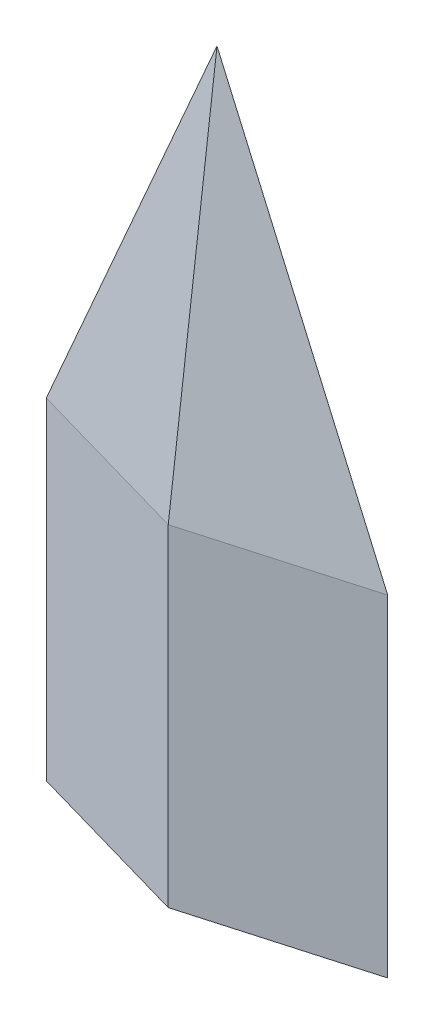
ISO-10303-21;
HEADER;
FILE_DESCRIPTION(('STEP AP214'),'2;1');
FILE_NAME('part.step','',(''),(''),'','','');
FILE_SCHEMA(('AUTOMOTIVE_DESIGN { 1 0 10303 214 1 1 1 1 }'));
ENDSEC;
DATA;
#1=APPLICATION_CONTEXT('core data for automotive mechanical design processes');
#2=APPLICATION_PROTOCOL_DEFINITION('international standard','automotive_design',2000,#1);
#3=PRODUCT_CONTEXT('',#1,'mechanical');
#4=PRODUCT('Part','Part','',(#3));
#5=PRODUCT_RELATED_PRODUCT_CATEGORY('part','',(#4));
#6=PRODUCT_DEFINITION_FORMATION('','',#4);
#7=PRODUCT_DEFINITION_CONTEXT('part definition',#1,'design');
#8=PRODUCT_DEFINITION('design','',#6,#7);
#9=PRODUCT_DEFINITION_SHAPE('','',#8);
#10=(LENGTH_UNIT() NAMED_UNIT(*) SI_UNIT(.MILLI.,.METRE.));
#11=(NAMED_UNIT(*) PLANE_ANGLE_UNIT() SI_UNIT($,.RADIAN.));
#12=(NAMED_UNIT(*) SI_UNIT($,.STERADIAN.) SOLID_ANGLE_UNIT());
#13=UNCERTAINTY_MEASURE_WITH_UNIT(LENGTH_MEASURE(1.E-05),#10,'distance_accuracy_value','');
#14=(GEOMETRIC_REPRESENTATION_CONTEXT(3) GLOBAL_UNCERTAINTY_ASSIGNED_CONTEXT((#13)) GLOBAL_UNIT_ASSIGNED_CONTEXT((#10,
#11,#12)) REPRESENTATION_CONTEXT('',''));
#15=CARTESIAN_POINT('',(0.,0.,0.));
#16=DIRECTION('',(0.,0.,1.));
#17=DIRECTION('',(1.,0.,0.));
#18=AXIS2_PLACEMENT_3D('',#15,#16,#17);
#19=CARTESIAN_POINT('',(35.,0.,0.));
#20=DIRECTION('',(0.274721127897378,0.,-0.961523947640823));
#21=DIRECTION('',(-0.961523947640823,0.,-0.274721127897378));
#22=AXIS2_PLACEMENT_3D('',#19,#20,#21);
#23=PLANE('',#22);
#24=DIRECTION('',(0.961523947640823,0.,0.274721127897378));
#25=VECTOR('',#24,1.);
#26=CARTESIAN_POINT('',(35.,542.,0.));
#27=LINE('',#26,#25);
#28=CARTESIAN_POINT('',(0.,542.,-10.));
#29=VERTEX_POINT('',#28);
#30=CARTESIAN_POINT('',(35.,542.,0.));
#31=VERTEX_POINT('',#30);
#32=EDGE_CURVE('E79',#29,#31,#27,.T.);
#33=ORIENTED_EDGE('',*,*,#32,.F.);
#34=DIRECTION('',(0.,1.,0.));
#35=VECTOR('',#34,1.);
#36=CARTESIAN_POINT('',(0.,0.,-10.));
#37=LINE('',#36,#35);
#38=CARTESIAN_POINT('',(0.,610.,-10.));
#39=VERTEX_POINT('',#38);
#40=EDGE_CURVE('E270',#29,#39,#37,.T.);
#41=ORIENTED_EDGE('',*,*,#40,.T.);
#42=DIRECTION('',(-0.961523947640823,0.,-0.274721127897378));
#43=VECTOR('',#42,1.);
#44=CARTESIAN_POINT('',(35.,610.,0.));
#45=LINE('',#44,#43);
#46=CARTESIAN_POINT('',(35.,610.,0.));
#47=VERTEX_POINT('',#46);
#48=EDGE_CURVE('E266',#47,#39,#45,.T.);
#49=ORIENTED_EDGE('',*,*,#48,.F.);
#50=DIRECTION('',(0.,1.,0.));
#51=VECTOR('',#50,1.);
#52=CARTESIAN_POINT('',(35.,0.,0.));
#53=LINE('',#52,#51);
#54=EDGE_CURVE('E264',#31,#47,#53,.T.);
#55=ORIENTED_EDGE('',*,*,#54,.F.);
#56=EDGE_LOOP('',(#33,#41,#49,#55));
#57=FACE_BOUND('',#56,.T.);
#58=ADVANCED_FACE('F55',(#57),#23,.T.);
#59=CARTESIAN_POINT('',(0.,0.,-10.));
#60=DIRECTION('',(-0.274721127897378,0.,-0.961523947640823));
#61=DIRECTION('',(-0.961523947640823,0.,0.274721127897378));
#62=AXIS2_PLACEMENT_3D('',#59,#60,#61);
#63=PLANE('',#62);
#64=DIRECTION('',(0.961523947640823,0.,-0.274721127897378));
#65=VECTOR('',#64,1.);
#66=CARTESIAN_POINT('',(0.,542.,-10.));
#67=LINE('',#66,#65);
#68=CARTESIAN_POINT('',(-35.,542.,0.));
#69=VERTEX_POINT('',#68);
#70=EDGE_CURVE('E166',#69,#29,#67,.T.);
#71=ORIENTED_EDGE('',*,*,#70,.F.);
#72=DIRECTION('',(0.,1.,0.));
#73=VECTOR('',#72,1.);
#74=CARTESIAN_POINT('',(-35.,0.,0.));
#75=LINE('',#74,#73);
#76=CARTESIAN_POINT('',(-35.,610.,0.));
#77=VERTEX_POINT('',#76);
#78=EDGE_CURVE('E12',#69,#77,#75,.T.);
#79=ORIENTED_EDGE('',*,*,#78,.T.);
#80=DIRECTION('',(-0.961523947640823,0.,0.274721127897378));
#81=VECTOR('',#80,1.);
#82=CARTESIAN_POINT('',(0.,610.,-10.));
#83=LINE('',#82,#81);
#84=EDGE_CURVE('E64',#39,#77,#83,.T.);
#85=ORIENTED_EDGE('',*,*,#84,.F.);
#86=ORIENTED_EDGE('',*,*,#40,.F.);
#87=EDGE_LOOP('',(#71,#79,#85,#86));
#88=FACE_BOUND('',#87,.T.);
#89=ADVANCED_FACE('F57',(#88),#63,.T.);
#90=CARTESIAN_POINT('',(0.,0.,10.));
#91=DIRECTION('',(-0.274721127897378,0.,0.961523947640823));
#92=DIRECTION('',(0.961523947640823,0.,0.274721127897378));
#93=AXIS2_PLACEMENT_3D('',#90,#91,#92);
#94=PLANE('',#93);
#95=DIRECTION('',(-0.961523947640823,0.,-0.274721127897378));
#96=VECTOR('',#95,1.);
#97=CARTESIAN_POINT('',(0.,542.,10.));
#98=LINE('',#97,#96);
#99=CARTESIAN_POINT('',(0.,542.,10.));
#100=VERTEX_POINT('',#99);
#101=EDGE_CURVE('E164',#100,#69,#98,.T.);
#102=ORIENTED_EDGE('',*,*,#101,.F.);
#103=DIRECTION('',(0.,1.,0.));
#104=VECTOR('',#103,1.);
#105=CARTESIAN_POINT('',(0.,0.,10.));
#106=LINE('',#105,#104);
#107=CARTESIAN_POINT('',(0.,610.,10.));
#108=VERTEX_POINT('',#107);
#109=EDGE_CURVE('E212',#100,#108,#106,.T.);
#110=ORIENTED_EDGE('',*,*,#109,.T.);
#111=DIRECTION('',(-0.961523947640823,0.,-0.274721127897378));
#112=VECTOR('',#111,1.);
#113=CARTESIAN_POINT('',(0.,610.,10.));
#114=LINE('',#113,#112);
#115=EDGE_CURVE('E220',#77,#108,#114,.F.);
#116=ORIENTED_EDGE('',*,*,#115,.F.);
#117=ORIENTED_EDGE('',*,*,#78,.F.);
#118=EDGE_LOOP('',(#102,#110,#116,#117));
#119=FACE_BOUND('',#118,.T.);
#120=ADVANCED_FACE('F204',(#119),#94,.T.);
#121=CARTESIAN_POINT('',(35.,0.,0.));
#122=DIRECTION('',(0.274721127897378,0.,0.961523947640823));
#123=DIRECTION('',(0.961523947640823,0.,-0.274721127897378));
#124=AXIS2_PLACEMENT_3D('',#121,#122,#123);
#125=PLANE('',#124);
#126=DIRECTION('',(-0.961523947640823,0.,0.274721127897378));
#127=VECTOR('',#126,1.);
#128=CARTESIAN_POINT('',(35.,542.,0.));
#129=LINE('',#128,#127);
#130=EDGE_CURVE('E162',#31,#100,#129,.T.);
#131=ORIENTED_EDGE('',*,*,#130,.F.);
#132=ORIENTED_EDGE('',*,*,#54,.T.);
#133=DIRECTION('',(-0.961523947640823,0.,0.274721127897378));
#134=VECTOR('',#133,1.);
#135=CARTESIAN_POINT('',(35.,610.,0.));
#136=LINE('',#135,#134);
#137=EDGE_CURVE('E219',#108,#47,#136,.F.);
#138=ORIENTED_EDGE('',*,*,#137,.F.);
#139=ORIENTED_EDGE('',*,*,#109,.F.);
#140=EDGE_LOOP('',(#131,#132,#138,#139));
#141=FACE_BOUND('',#140,.T.);
#142=ADVANCED_FACE('F240',(#141),#125,.T.);
#143=CARTESIAN_POINT('',(-22.4585876198779,9.82563208369661,-78.6050566695728));
#144=DIRECTION('',(-0.272758093597209,0.119331665948779,-0.954653327590233));
#145=DIRECTION('',(-0.961523947640823,0.,0.274721127897378));
#146=AXIS2_PLACEMENT_3D('',#143,#144,#145);
#147=PLANE('',#146);
#148=ORIENTED_EDGE('',*,*,#84,.T.);
#149=DIRECTION('',(0.400818834019708,0.916157334902189,0.));
#150=VECTOR('',#149,1.);
#151=CARTESIAN_POINT('',(-35.,610.,0.));
#152=LINE('',#151,#150);
#153=CARTESIAN_POINT('',(0.,690.,0.));
#154=VERTEX_POINT('',#153);
#155=EDGE_CURVE('E179',#77,#154,#152,.T.);
#156=ORIENTED_EDGE('',*,*,#155,.T.);
#157=DIRECTION('',(0.,0.992277876713668,0.124034734589209));
#158=VECTOR('',#157,1.);
#159=CARTESIAN_POINT('',(0.,610.,-10.));
#160=LINE('',#159,#158);
#161=EDGE_CURVE('E229',#39,#154,#160,.T.);
#162=ORIENTED_EDGE('',*,*,#161,.F.);
#163=EDGE_LOOP('',(#148,#156,#162));
#164=FACE_BOUND('',#163,.T.);
#165=ADVANCED_FACE('F231',(#164),#147,.T.);
#166=CARTESIAN_POINT('',(22.4585876198779,9.82563208369661,-78.6050566695728));
#167=DIRECTION('',(0.272758093597209,0.119331665948779,-0.954653327590233));
#168=DIRECTION('',(-0.961523947640823,0.,-0.274721127897378));
#169=AXIS2_PLACEMENT_3D('',#166,#167,#168);
#170=PLANE('',#169);
#171=ORIENTED_EDGE('',*,*,#161,.T.);
#172=DIRECTION('',(-0.400818834019708,0.916157334902189,0.));
#173=VECTOR('',#172,1.);
#174=CARTESIAN_POINT('',(35.,610.,0.));
#175=LINE('',#174,#173);
#176=EDGE_CURVE('E260',#47,#154,#175,.T.);
#177=ORIENTED_EDGE('',*,*,#176,.F.);
#178=ORIENTED_EDGE('',*,*,#48,.T.);
#179=EDGE_LOOP('',(#171,#177,#178));
#180=FACE_BOUND('',#179,.T.);
#181=ADVANCED_FACE('F196',(#180),#170,.T.);
#182=CARTESIAN_POINT('',(-22.4585876198779,9.82563208369661,78.6050566695728));
#183=DIRECTION('',(-0.272758093597209,0.119331665948779,0.954653327590233));
#184=DIRECTION('',(-0.961523947640823,0.,-0.274721127897378));
#185=AXIS2_PLACEMENT_3D('',#182,#183,#184);
#186=PLANE('',#185);
#187=ORIENTED_EDGE('',*,*,#115,.T.);
#188=DIRECTION('',(0.,0.992277876713668,-0.124034734589209));
#189=VECTOR('',#188,1.);
#190=CARTESIAN_POINT('',(0.,610.,10.));
#191=LINE('',#190,#189);
#192=EDGE_CURVE('E172',#108,#154,#191,.T.);
#193=ORIENTED_EDGE('',*,*,#192,.T.);
#194=ORIENTED_EDGE('',*,*,#155,.F.);
#195=EDGE_LOOP('',(#187,#193,#194));
#196=FACE_BOUND('',#195,.T.);
#197=ADVANCED_FACE('F185',(#196),#186,.T.);
#198=CARTESIAN_POINT('',(22.4585876198779,9.82563208369661,78.6050566695728));
#199=DIRECTION('',(0.272758093597209,0.119331665948779,0.954653327590233));
#200=DIRECTION('',(-0.961523947640823,0.,0.274721127897378));
#201=AXIS2_PLACEMENT_3D('',#198,#199,#200);
#202=PLANE('',#201);
#203=ORIENTED_EDGE('',*,*,#192,.F.);
#204=ORIENTED_EDGE('',*,*,#137,.T.);
#205=ORIENTED_EDGE('',*,*,#176,.T.);
#206=EDGE_LOOP('',(#203,#204,#205));
#207=FACE_BOUND('',#206,.T.);
#208=ADVANCED_FACE('F195',(#207),#202,.T.);
#209=CARTESIAN_POINT('',(0.,542.,-10.000025));
#210=DIRECTION('',(0.,1.,0.));
#211=DIRECTION('',(0.,0.,1.));
#212=AXIS2_PLACEMENT_3D('',#209,#210,#211);
#213=PLANE('',#212);
#214=DIRECTION('',(0.961523947640823,0.,0.274721127897378));
#215=VECTOR('',#214,1.);
#216=CARTESIAN_POINT('',(0.,542.,-7.08795604428779));
#217=LINE('',#216,#215);
#218=CARTESIAN_POINT('',(0.,542.,-7.08795604428779));
#219=VERTEX_POINT('',#218);
#220=CARTESIAN_POINT('',(24.8078461550073,542.,0.));
#221=VERTEX_POINT('',#220);
#222=EDGE_CURVE('E153',#219,#221,#217,.T.);
#223=ORIENTED_EDGE('',*,*,#222,.F.);
#224=DIRECTION('',(0.961523947640823,0.,-0.274721127897378));
#225=VECTOR('',#224,1.);
#226=CARTESIAN_POINT('',(-24.8078461550073,542.,0.));
#227=LINE('',#226,#225);
#228=CARTESIAN_POINT('',(-24.8078461550073,542.,0.));
#229=VERTEX_POINT('',#228);
#230=EDGE_CURVE('E71',#229,#219,#227,.T.);
#231=ORIENTED_EDGE('',*,*,#230,.F.);
#232=DIRECTION('',(-0.961523947640823,0.,-0.274721127897378));
#233=VECTOR('',#232,1.);
#234=CARTESIAN_POINT('',(0.,542.,7.08795604428779));
#235=LINE('',#234,#233);
#236=CARTESIAN_POINT('',(0.,542.,7.08795604428779));
#237=VERTEX_POINT('',#236);
#238=EDGE_CURVE('E144',#237,#229,#235,.T.);
#239=ORIENTED_EDGE('',*,*,#238,.F.);
#240=DIRECTION('',(-0.961523947640823,0.,0.274721127897378));
#241=VECTOR('',#240,1.);
#242=CARTESIAN_POINT('',(24.8078461550073,542.,0.));
#243=LINE('',#242,#241);
#244=EDGE_CURVE('E147',#221,#237,#243,.T.);
#245=ORIENTED_EDGE('',*,*,#244,.F.);
#246=EDGE_LOOP('',(#223,#231,#239,#245));
#247=FACE_BOUND('',#246,.T.);
#248=ORIENTED_EDGE('',*,*,#32,.T.);
#249=ORIENTED_EDGE('',*,*,#130,.T.);
#250=ORIENTED_EDGE('',*,*,#101,.T.);
#251=ORIENTED_EDGE('',*,*,#70,.T.);
#252=EDGE_LOOP('',(#248,#249,#250,#251));
#253=FACE_BOUND('',#252,.T.);
#254=ADVANCED_FACE('F202',(#247,#253),#213,.F.);
#255=CARTESIAN_POINT('',(0.,583.,0.));
#256=DIRECTION('',(0.,-1.,0.));
#257=DIRECTION('',(0.,0.,-1.));
#258=AXIS2_PLACEMENT_3D('',#255,#256,#257);
#259=PLANE('',#258);
#260=DIRECTION('',(0.961523947640823,0.,-0.274721127897378));
#261=VECTOR('',#260,1.);
#262=CARTESIAN_POINT('',(-24.8078461550073,583.,0.));
#263=LINE('',#262,#261);
#264=CARTESIAN_POINT('',(-24.8078461550073,583.,0.));
#265=VERTEX_POINT('',#264);
#266=CARTESIAN_POINT('',(0.,583.,-7.08795604428779));
#267=VERTEX_POINT('',#266);
#268=EDGE_CURVE('E125',#265,#267,#263,.T.);
#269=ORIENTED_EDGE('',*,*,#268,.T.);
#270=DIRECTION('',(0.961523947640823,0.,0.274721127897378));
#271=VECTOR('',#270,1.);
#272=CARTESIAN_POINT('',(0.,583.,-7.08795604428779));
#273=LINE('',#272,#271);
#274=CARTESIAN_POINT('',(24.8078461550073,583.,0.));
#275=VERTEX_POINT('',#274);
#276=EDGE_CURVE('E134',#267,#275,#273,.T.);
#277=ORIENTED_EDGE('',*,*,#276,.T.);
#278=DIRECTION('',(-0.961523947640823,0.,0.274721127897378));
#279=VECTOR('',#278,1.);
#280=CARTESIAN_POINT('',(24.8078461550073,583.,0.));
#281=LINE('',#280,#279);
#282=CARTESIAN_POINT('',(0.,583.,7.08795604428779));
#283=VERTEX_POINT('',#282);
#284=EDGE_CURVE('E139',#275,#283,#281,.T.);
#285=ORIENTED_EDGE('',*,*,#284,.T.);
#286=DIRECTION('',(-0.961523947640823,0.,-0.274721127897378));
#287=VECTOR('',#286,1.);
#288=CARTESIAN_POINT('',(0.,583.,7.08795604428779));
#289=LINE('',#288,#287);
#290=EDGE_CURVE('E131',#283,#265,#289,.T.);
#291=ORIENTED_EDGE('',*,*,#290,.T.);
#292=EDGE_LOOP('',(#269,#277,#285,#291));
#293=FACE_BOUND('',#292,.T.);
#294=CARTESIAN_POINT('',(0.,583.,0.));
#295=DIRECTION('',(0.,-1.,0.));
#296=DIRECTION('',(0.,0.,-1.));
#297=AXIS2_PLACEMENT_3D('',#294,#295,#296);
#298=CIRCLE('',#297,1.75);
#299=CARTESIAN_POINT('',(0.,583.,-1.75));
#300=VERTEX_POINT('',#299);
#301=EDGE_CURVE('E59',#300,#300,#298,.F.);
#302=ORIENTED_EDGE('',*,*,#301,.T.);
#303=EDGE_LOOP('',(#302));
#304=FACE_BOUND('',#303,.T.);
#305=ADVANCED_FACE('F141',(#293,#304),#259,.T.);
#306=CARTESIAN_POINT('',(-24.8078461550073,583.,0.));
#307=DIRECTION('',(-0.274721127897378,0.,-0.961523947640823));
#308=DIRECTION('',(-0.961523947640823,0.,0.274721127897378));
#309=AXIS2_PLACEMENT_3D('',#306,#307,#308);
#310=PLANE('',#309);
#311=ORIENTED_EDGE('',*,*,#230,.T.);
#312=DIRECTION('',(0.,-1.,0.));
#313=VECTOR('',#312,1.);
#314=CARTESIAN_POINT('',(0.,583.,-7.08795604428779));
#315=LINE('',#314,#313);
#316=EDGE_CURVE('E121',#267,#219,#315,.T.);
#317=ORIENTED_EDGE('',*,*,#316,.F.);
#318=ORIENTED_EDGE('',*,*,#268,.F.);
#319=DIRECTION('',(0.,-1.,0.));
#320=VECTOR('',#319,1.);
#321=CARTESIAN_POINT('',(-24.8078461550073,583.,0.));
#322=LINE('',#321,#320);
#323=EDGE_CURVE('E157',#265,#229,#322,.T.);
#324=ORIENTED_EDGE('',*,*,#323,.T.);
#325=EDGE_LOOP('',(#311,#317,#318,#324));
#326=FACE_BOUND('',#325,.T.);
#327=ADVANCED_FACE('F123',(#326),#310,.F.);
#328=CARTESIAN_POINT('',(0.,583.,7.08795604428779));
#329=DIRECTION('',(-0.274721127897378,0.,0.961523947640823));
#330=DIRECTION('',(0.961523947640823,0.,0.274721127897378));
#331=AXIS2_PLACEMENT_3D('',#328,#329,#330);
#332=PLANE('',#331);
#333=ORIENTED_EDGE('',*,*,#238,.T.);
#334=ORIENTED_EDGE('',*,*,#323,.F.);
#335=ORIENTED_EDGE('',*,*,#290,.F.);
#336=DIRECTION('',(0.,-1.,0.));
#337=VECTOR('',#336,1.);
#338=CARTESIAN_POINT('',(0.,583.,7.08795604428779));
#339=LINE('',#338,#337);
#340=EDGE_CURVE('E159',#283,#237,#339,.T.);
#341=ORIENTED_EDGE('',*,*,#340,.T.);
#342=EDGE_LOOP('',(#333,#334,#335,#341));
#343=FACE_BOUND('',#342,.T.);
#344=ADVANCED_FACE('F413',(#343),#332,.F.);
#345=CARTESIAN_POINT('',(24.8078461550073,583.,0.));
#346=DIRECTION('',(0.274721127897378,0.,0.961523947640823));
#347=DIRECTION('',(0.961523947640823,0.,-0.274721127897378));
#348=AXIS2_PLACEMENT_3D('',#345,#346,#347);
#349=PLANE('',#348);
#350=ORIENTED_EDGE('',*,*,#244,.T.);
#351=ORIENTED_EDGE('',*,*,#340,.F.);
#352=ORIENTED_EDGE('',*,*,#284,.F.);
#353=DIRECTION('',(0.,-1.,0.));
#354=VECTOR('',#353,1.);
#355=CARTESIAN_POINT('',(24.8078461550073,583.,0.));
#356=LINE('',#355,#354);
#357=EDGE_CURVE('E130',#275,#221,#356,.T.);
#358=ORIENTED_EDGE('',*,*,#357,.T.);
#359=EDGE_LOOP('',(#350,#351,#352,#358));
#360=FACE_BOUND('',#359,.T.);
#361=ADVANCED_FACE('F421',(#360),#349,.F.);
#362=CARTESIAN_POINT('',(0.,583.,-7.08795604428779));
#363=DIRECTION('',(0.274721127897378,0.,-0.961523947640823));
#364=DIRECTION('',(-0.961523947640823,0.,-0.274721127897378));
#365=AXIS2_PLACEMENT_3D('',#362,#363,#364);
#366=PLANE('',#365);
#367=ORIENTED_EDGE('',*,*,#222,.T.);
#368=ORIENTED_EDGE('',*,*,#357,.F.);
#369=ORIENTED_EDGE('',*,*,#276,.F.);
#370=ORIENTED_EDGE('',*,*,#316,.T.);
#371=EDGE_LOOP('',(#367,#368,#369,#370));
#372=FACE_BOUND('',#371,.T.);
#373=ADVANCED_FACE('F135',(#372),#366,.F.);
#374=CARTESIAN_POINT('',(0.,612.,0.));
#375=DIRECTION('',(0.,-1.,0.));
#376=DIRECTION('',(0.,0.,-1.));
#377=AXIS2_PLACEMENT_3D('',#374,#375,#376);
#378=PLANE('',#377);
#379=CARTESIAN_POINT('',(0.,612.,0.));
#380=DIRECTION('',(0.,-1.,0.));
#381=DIRECTION('',(0.,0.,-1.));
#382=AXIS2_PLACEMENT_3D('',#379,#380,#381);
#383=CIRCLE('',#382,1.75);
#384=CARTESIAN_POINT('',(0.,612.,-1.75));
#385=VERTEX_POINT('',#384);
#386=EDGE_CURVE('E169',#385,#385,#383,.T.);
#387=ORIENTED_EDGE('',*,*,#386,.T.);
#388=EDGE_LOOP('',(#387));
#389=FACE_BOUND('',#388,.T.);
#390=ADVANCED_FACE('F342',(#389),#378,.T.);
#391=CARTESIAN_POINT('',(0.,612.,0.));
#392=DIRECTION('',(0.,-1.,0.));
#393=DIRECTION('',(0.,0.,-1.));
#394=AXIS2_PLACEMENT_3D('',#391,#392,#393);
#395=CYLINDRICAL_SURFACE('',#394,1.75);
#396=ORIENTED_EDGE('',*,*,#386,.F.);
#397=EDGE_LOOP('',(#396));
#398=FACE_BOUND('',#397,.T.);
#399=ORIENTED_EDGE('',*,*,#301,.F.);
#400=EDGE_LOOP('',(#399));
#401=FACE_BOUND('',#400,.T.);
#402=ADVANCED_FACE('F197',(#398,#401),#395,.F.);
#403=CLOSED_SHELL('',(#58,#89,#120,#142,#165,#181,#197,#208,#254,#305,#327,#344,#361,#373,#390,#402));
#404=MANIFOLD_SOLID_BREP('B2',#403);
#405=ADVANCED_BREP_SHAPE_REPRESENTATION('',(#18,#404),#14);
#406=SHAPE_DEFINITION_REPRESENTATION(#9,#405);
ENDSEC;
END-ISO-10303-21;
